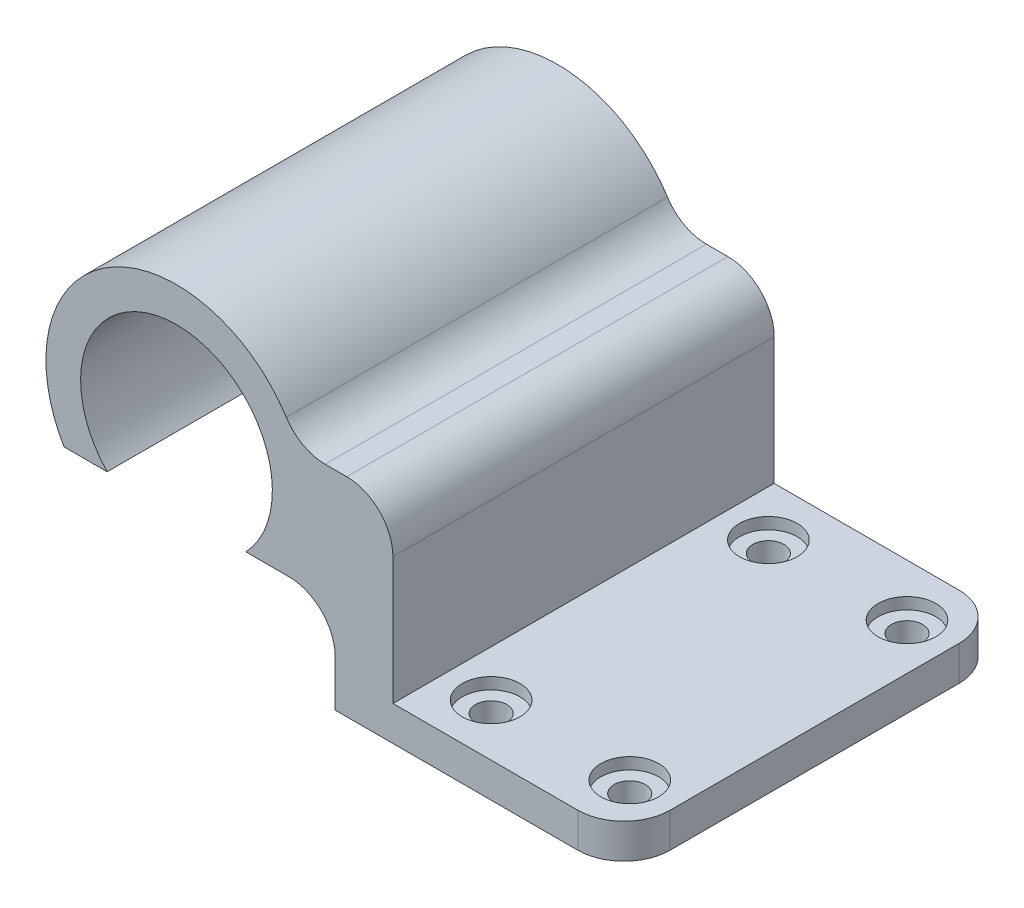
ISO-10303-21;
HEADER;
FILE_DESCRIPTION(('STEP AP214'),'2;1');
FILE_NAME('part.step','',(''),(''),'','','');
FILE_SCHEMA(('AUTOMOTIVE_DESIGN { 1 0 10303 214 1 1 1 1 }'));
ENDSEC;
DATA;
#1=APPLICATION_CONTEXT('core data for automotive mechanical design processes');
#2=APPLICATION_PROTOCOL_DEFINITION('international standard','automotive_design',2000,#1);
#3=PRODUCT_CONTEXT('',#1,'mechanical');
#4=PRODUCT('Part','Part','',(#3));
#5=PRODUCT_RELATED_PRODUCT_CATEGORY('part','',(#4));
#6=PRODUCT_DEFINITION_FORMATION('','',#4);
#7=PRODUCT_DEFINITION_CONTEXT('part definition',#1,'design');
#8=PRODUCT_DEFINITION('design','',#6,#7);
#9=PRODUCT_DEFINITION_SHAPE('','',#8);
#10=(LENGTH_UNIT() NAMED_UNIT(*) SI_UNIT(.MILLI.,.METRE.));
#11=(NAMED_UNIT(*) PLANE_ANGLE_UNIT() SI_UNIT($,.RADIAN.));
#12=(NAMED_UNIT(*) SI_UNIT($,.STERADIAN.) SOLID_ANGLE_UNIT());
#13=UNCERTAINTY_MEASURE_WITH_UNIT(LENGTH_MEASURE(1.E-05),#10,'distance_accuracy_value','');
#14=(GEOMETRIC_REPRESENTATION_CONTEXT(3) GLOBAL_UNCERTAINTY_ASSIGNED_CONTEXT((#13)) GLOBAL_UNIT_ASSIGNED_CONTEXT((#10,
#11,#12)) REPRESENTATION_CONTEXT('',''));
#15=CARTESIAN_POINT('',(0.,0.,0.));
#16=DIRECTION('',(0.,0.,1.));
#17=DIRECTION('',(1.,0.,0.));
#18=AXIS2_PLACEMENT_3D('',#15,#16,#17);
#19=CARTESIAN_POINT('',(22.7365291557105,-20.7349803835759,4.5));
#20=DIRECTION('',(0.,1.,0.));
#21=DIRECTION('',(-1.,0.,0.));
#22=AXIS2_PLACEMENT_3D('',#19,#20,#21);
#23=CYLINDRICAL_SURFACE('',#22,1.35);
#24=CARTESIAN_POINT('',(22.7365291557105,-13.7349803835759,4.5));
#25=DIRECTION('',(0.,-1.,0.));
#26=DIRECTION('',(1.,0.,0.));
#27=AXIS2_PLACEMENT_3D('',#24,#25,#26);
#28=CIRCLE('',#27,1.35);
#29=CARTESIAN_POINT('',(24.0865291557105,-13.7349803835759,4.5));
#30=VERTEX_POINT('',#29);
#31=EDGE_CURVE('E183',#30,#30,#28,.T.);
#32=ORIENTED_EDGE('',*,*,#31,.T.);
#33=EDGE_LOOP('',(#32));
#34=FACE_BOUND('',#33,.T.);
#35=CARTESIAN_POINT('',(22.7365291557105,-11.7349803835759,4.5));
#36=DIRECTION('',(0.,1.,0.));
#37=DIRECTION('',(-1.,0.,0.));
#38=AXIS2_PLACEMENT_3D('',#35,#36,#37);
#39=CIRCLE('',#38,1.35);
#40=CARTESIAN_POINT('',(21.3865291557105,-11.7349803835759,4.5));
#41=VERTEX_POINT('',#40);
#42=EDGE_CURVE('E272',#41,#41,#39,.F.);
#43=ORIENTED_EDGE('',*,*,#42,.F.);
#44=EDGE_LOOP('',(#43));
#45=FACE_BOUND('',#44,.T.);
#46=ADVANCED_FACE('F35',(#34,#45),#23,.F.);
#47=CARTESIAN_POINT('',(34.7365291557105,-20.7349803835759,28.5));
#48=DIRECTION('',(0.,1.,0.));
#49=DIRECTION('',(-1.,0.,0.));
#50=AXIS2_PLACEMENT_3D('',#47,#48,#49);
#51=CYLINDRICAL_SURFACE('',#50,1.35);
#52=CARTESIAN_POINT('',(34.7365291557105,-13.7349803835759,28.5));
#53=DIRECTION('',(0.,-1.,0.));
#54=DIRECTION('',(1.,0.,0.));
#55=AXIS2_PLACEMENT_3D('',#52,#53,#54);
#56=CIRCLE('',#55,1.35);
#57=CARTESIAN_POINT('',(36.0865291557105,-13.7349803835759,28.5));
#58=VERTEX_POINT('',#57);
#59=EDGE_CURVE('E256',#58,#58,#56,.T.);
#60=ORIENTED_EDGE('',*,*,#59,.T.);
#61=EDGE_LOOP('',(#60));
#62=FACE_BOUND('',#61,.T.);
#63=CARTESIAN_POINT('',(34.7365291557105,-11.7349803835759,28.5));
#64=DIRECTION('',(0.,1.,0.));
#65=DIRECTION('',(-1.,0.,0.));
#66=AXIS2_PLACEMENT_3D('',#63,#64,#65);
#67=CIRCLE('',#66,1.35);
#68=CARTESIAN_POINT('',(33.3865291557105,-11.7349803835759,28.5));
#69=VERTEX_POINT('',#68);
#70=EDGE_CURVE('E268',#69,#69,#67,.F.);
#71=ORIENTED_EDGE('',*,*,#70,.F.);
#72=EDGE_LOOP('',(#71));
#73=FACE_BOUND('',#72,.T.);
#74=ADVANCED_FACE('F348',(#62,#73),#51,.F.);
#75=CARTESIAN_POINT('',(34.7365291557105,-20.7349803835759,4.5));
#76=DIRECTION('',(0.,1.,0.));
#77=DIRECTION('',(-1.,0.,0.));
#78=AXIS2_PLACEMENT_3D('',#75,#76,#77);
#79=CYLINDRICAL_SURFACE('',#78,1.35);
#80=CARTESIAN_POINT('',(34.7365291557105,-13.7349803835759,4.5));
#81=DIRECTION('',(0.,-1.,0.));
#82=DIRECTION('',(1.,0.,0.));
#83=AXIS2_PLACEMENT_3D('',#80,#81,#82);
#84=CIRCLE('',#83,1.35);
#85=CARTESIAN_POINT('',(36.0865291557105,-13.7349803835759,4.5));
#86=VERTEX_POINT('',#85);
#87=EDGE_CURVE('E252',#86,#86,#84,.T.);
#88=ORIENTED_EDGE('',*,*,#87,.T.);
#89=EDGE_LOOP('',(#88));
#90=FACE_BOUND('',#89,.T.);
#91=CARTESIAN_POINT('',(34.7365291557105,-11.7349803835759,4.5));
#92=DIRECTION('',(0.,1.,0.));
#93=DIRECTION('',(-1.,0.,0.));
#94=AXIS2_PLACEMENT_3D('',#91,#92,#93);
#95=CIRCLE('',#94,1.35);
#96=CARTESIAN_POINT('',(33.3865291557105,-11.7349803835759,4.5));
#97=VERTEX_POINT('',#96);
#98=EDGE_CURVE('E265',#97,#97,#95,.F.);
#99=ORIENTED_EDGE('',*,*,#98,.F.);
#100=EDGE_LOOP('',(#99));
#101=FACE_BOUND('',#100,.T.);
#102=ADVANCED_FACE('F354',(#90,#101),#79,.F.);
#103=CARTESIAN_POINT('',(22.7365291557105,-20.7349803835759,28.5));
#104=DIRECTION('',(0.,1.,0.));
#105=DIRECTION('',(-1.,0.,0.));
#106=AXIS2_PLACEMENT_3D('',#103,#104,#105);
#107=CYLINDRICAL_SURFACE('',#106,1.35);
#108=CARTESIAN_POINT('',(22.7365291557105,-13.7349803835759,28.5));
#109=DIRECTION('',(0.,-1.,0.));
#110=DIRECTION('',(1.,0.,0.));
#111=AXIS2_PLACEMENT_3D('',#108,#109,#110);
#112=CIRCLE('',#111,1.35);
#113=CARTESIAN_POINT('',(24.0865291557105,-13.7349803835759,28.5));
#114=VERTEX_POINT('',#113);
#115=EDGE_CURVE('E253',#114,#114,#112,.T.);
#116=ORIENTED_EDGE('',*,*,#115,.T.);
#117=EDGE_LOOP('',(#116));
#118=FACE_BOUND('',#117,.T.);
#119=CARTESIAN_POINT('',(22.7365291557105,-11.7349803835759,28.5));
#120=DIRECTION('',(0.,1.,0.));
#121=DIRECTION('',(-1.,0.,0.));
#122=AXIS2_PLACEMENT_3D('',#119,#120,#121);
#123=CIRCLE('',#122,1.35);
#124=CARTESIAN_POINT('',(21.3865291557105,-11.7349803835759,28.5));
#125=VERTEX_POINT('',#124);
#126=EDGE_CURVE('E257',#125,#125,#123,.F.);
#127=ORIENTED_EDGE('',*,*,#126,.F.);
#128=EDGE_LOOP('',(#127));
#129=FACE_BOUND('',#128,.T.);
#130=ADVANCED_FACE('F360',(#118,#129),#107,.F.);
#131=CARTESIAN_POINT('',(0.,-5.73498038357587,33.));
#132=DIRECTION('',(0.,1.,0.));
#133=DIRECTION('',(0.,0.,1.));
#134=AXIS2_PLACEMENT_3D('',#131,#132,#133);
#135=PLANE('',#134);
#136=DIRECTION('',(1.,0.,0.));
#137=VECTOR('',#136,1.);
#138=CARTESIAN_POINT('',(0.,-5.73498038357587,0.));
#139=LINE('',#138,#137);
#140=CARTESIAN_POINT('',(6.,-5.73498038357587,0.));
#141=VERTEX_POINT('',#140);
#142=CARTESIAN_POINT('',(9.73652915571047,-5.73498038357587,0.));
#143=VERTEX_POINT('',#142);
#144=EDGE_CURVE('E186',#141,#143,#139,.T.);
#145=ORIENTED_EDGE('',*,*,#144,.T.);
#146=DIRECTION('',(0.,0.,-1.));
#147=VECTOR('',#146,1.);
#148=CARTESIAN_POINT('',(9.73652915571047,-5.73498038357587,33.));
#149=LINE('',#148,#147);
#150=CARTESIAN_POINT('',(9.73652915571047,-5.73498038357587,33.));
#151=VERTEX_POINT('',#150);
#152=EDGE_CURVE('E244',#143,#151,#149,.F.);
#153=ORIENTED_EDGE('',*,*,#152,.T.);
#154=DIRECTION('',(1.,0.,0.));
#155=VECTOR('',#154,1.);
#156=CARTESIAN_POINT('',(0.,-5.73498038357587,33.));
#157=LINE('',#156,#155);
#158=CARTESIAN_POINT('',(6.,-5.73498038357587,33.));
#159=VERTEX_POINT('',#158);
#160=EDGE_CURVE('E198',#159,#151,#157,.T.);
#161=ORIENTED_EDGE('',*,*,#160,.F.);
#162=DIRECTION('',(0.,0.,-1.));
#163=VECTOR('',#162,1.);
#164=CARTESIAN_POINT('',(6.,-5.73498038357587,33.));
#165=LINE('',#164,#163);
#166=EDGE_CURVE('E209',#159,#141,#165,.T.);
#167=ORIENTED_EDGE('',*,*,#166,.T.);
#168=EDGE_LOOP('',(#145,#153,#161,#167));
#169=FACE_BOUND('',#168,.T.);
#170=ADVANCED_FACE('F306',(#169),#135,.F.);
#171=CARTESIAN_POINT('',(0.,0.,33.));
#172=DIRECTION('',(0.,0.,-1.));
#173=DIRECTION('',(-1.,0.,0.));
#174=AXIS2_PLACEMENT_3D('',#171,#172,#173);
#175=CYLINDRICAL_SURFACE('',#174,11.3);
#176=CARTESIAN_POINT('',(0.,0.,33.));
#177=DIRECTION('',(0.,0.,1.));
#178=DIRECTION('',(1.,0.,0.));
#179=AXIS2_PLACEMENT_3D('',#176,#177,#178);
#180=CIRCLE('',#179,11.3);
#181=CARTESIAN_POINT('',(9.50938347003215,6.10423017422175,33.));
#182=VERTEX_POINT('',#181);
#183=CARTESIAN_POINT('',(-9.73652915571047,-5.73498038357586,33.));
#184=VERTEX_POINT('',#183);
#185=EDGE_CURVE('E201',#182,#184,#180,.T.);
#186=ORIENTED_EDGE('',*,*,#185,.F.);
#187=DIRECTION('',(0.,0.,-1.));
#188=VECTOR('',#187,1.);
#189=CARTESIAN_POINT('',(9.50938347003216,6.10423017422175,33.));
#190=LINE('',#189,#188);
#191=CARTESIAN_POINT('',(9.50938347003215,6.10423017422175,0.));
#192=VERTEX_POINT('',#191);
#193=EDGE_CURVE('E236',#182,#192,#190,.T.);
#194=ORIENTED_EDGE('',*,*,#193,.T.);
#195=CARTESIAN_POINT('',(0.,0.,0.));
#196=DIRECTION('',(0.,0.,1.));
#197=DIRECTION('',(1.,0.,0.));
#198=AXIS2_PLACEMENT_3D('',#195,#196,#197);
#199=CIRCLE('',#198,11.3);
#200=CARTESIAN_POINT('',(-9.73652915571047,-5.73498038357586,0.));
#201=VERTEX_POINT('',#200);
#202=EDGE_CURVE('E212',#192,#201,#199,.T.);
#203=ORIENTED_EDGE('',*,*,#202,.T.);
#204=DIRECTION('',(0.,0.,-1.));
#205=VECTOR('',#204,1.);
#206=CARTESIAN_POINT('',(-9.73652915571047,-5.73498038357586,33.));
#207=LINE('',#206,#205);
#208=EDGE_CURVE('E222',#184,#201,#207,.T.);
#209=ORIENTED_EDGE('',*,*,#208,.F.);
#210=EDGE_LOOP('',(#186,#194,#203,#209));
#211=FACE_BOUND('',#210,.T.);
#212=ADVANCED_FACE('F320',(#211),#175,.T.);
#213=CARTESIAN_POINT('',(0.,-5.73498038357586,33.));
#214=DIRECTION('',(0.,1.,0.));
#215=DIRECTION('',(0.,0.,1.));
#216=AXIS2_PLACEMENT_3D('',#213,#214,#215);
#217=PLANE('',#216);
#218=DIRECTION('',(1.,0.,0.));
#219=VECTOR('',#218,1.);
#220=CARTESIAN_POINT('',(0.,-5.73498038357586,0.));
#221=LINE('',#220,#219);
#222=CARTESIAN_POINT('',(-6.,-5.73498038357586,0.));
#223=VERTEX_POINT('',#222);
#224=EDGE_CURVE('E214',#201,#223,#221,.T.);
#225=ORIENTED_EDGE('',*,*,#224,.T.);
#226=DIRECTION('',(0.,0.,-1.));
#227=VECTOR('',#226,1.);
#228=CARTESIAN_POINT('',(-6.,-5.73498038357586,33.));
#229=LINE('',#228,#227);
#230=CARTESIAN_POINT('',(-6.,-5.73498038357586,33.));
#231=VERTEX_POINT('',#230);
#232=EDGE_CURVE('E220',#231,#223,#229,.T.);
#233=ORIENTED_EDGE('',*,*,#232,.F.);
#234=DIRECTION('',(1.,0.,0.));
#235=VECTOR('',#234,1.);
#236=CARTESIAN_POINT('',(0.,-5.73498038357586,33.));
#237=LINE('',#236,#235);
#238=EDGE_CURVE('E204',#184,#231,#237,.T.);
#239=ORIENTED_EDGE('',*,*,#238,.F.);
#240=ORIENTED_EDGE('',*,*,#208,.T.);
#241=EDGE_LOOP('',(#225,#233,#239,#240));
#242=FACE_BOUND('',#241,.T.);
#243=ADVANCED_FACE('F315',(#242),#217,.F.);
#244=CARTESIAN_POINT('',(0.,0.,33.));
#245=DIRECTION('',(0.,0.,-1.));
#246=DIRECTION('',(-1.,0.,0.));
#247=AXIS2_PLACEMENT_3D('',#244,#245,#246);
#248=CYLINDRICAL_SURFACE('',#247,8.3);
#249=CARTESIAN_POINT('',(0.,0.,0.));
#250=DIRECTION('',(0.,0.,1.));
#251=DIRECTION('',(1.,0.,0.));
#252=AXIS2_PLACEMENT_3D('',#249,#250,#251);
#253=CIRCLE('',#252,8.3);
#254=EDGE_CURVE('E202',#141,#223,#253,.T.);
#255=ORIENTED_EDGE('',*,*,#254,.F.);
#256=ORIENTED_EDGE('',*,*,#166,.F.);
#257=CARTESIAN_POINT('',(0.,0.,33.));
#258=DIRECTION('',(0.,0.,1.));
#259=DIRECTION('',(1.,0.,0.));
#260=AXIS2_PLACEMENT_3D('',#257,#258,#259);
#261=CIRCLE('',#260,8.3);
#262=EDGE_CURVE('E206',#159,#231,#261,.T.);
#263=ORIENTED_EDGE('',*,*,#262,.T.);
#264=ORIENTED_EDGE('',*,*,#232,.T.);
#265=EDGE_LOOP('',(#255,#256,#263,#264));
#266=FACE_BOUND('',#265,.T.);
#267=ADVANCED_FACE('F310',(#266),#248,.F.);
#268=CARTESIAN_POINT('',(0.,0.,33.));
#269=DIRECTION('',(0.,0.,1.));
#270=DIRECTION('',(1.,0.,0.));
#271=AXIS2_PLACEMENT_3D('',#268,#269,#270);
#272=PLANE('',#271);
#273=DIRECTION('',(-1.,0.,0.));
#274=VECTOR('',#273,1.);
#275=CARTESIAN_POINT('',(38.7365291557105,-13.7349803835759,33.));
#276=LINE('',#275,#274);
#277=CARTESIAN_POINT('',(34.7365291557105,-13.7349803835759,33.));
#278=VERTEX_POINT('',#277);
#279=CARTESIAN_POINT('',(13.7365291557105,-13.7349803835759,33.));
#280=VERTEX_POINT('',#279);
#281=EDGE_CURVE('E159',#278,#280,#276,.T.);
#282=ORIENTED_EDGE('',*,*,#281,.F.);
#283=DIRECTION('',(0.,-1.,0.));
#284=VECTOR('',#283,1.);
#285=CARTESIAN_POINT('',(34.7365291557105,0.,33.));
#286=LINE('',#285,#284);
#287=CARTESIAN_POINT('',(34.7365291557105,-10.7349803835759,33.));
#288=VERTEX_POINT('',#287);
#289=EDGE_CURVE('E11',#278,#288,#286,.F.);
#290=ORIENTED_EDGE('',*,*,#289,.T.);
#291=DIRECTION('',(1.,0.,0.));
#292=VECTOR('',#291,1.);
#293=CARTESIAN_POINT('',(18.7365291557105,-10.7349803835759,33.));
#294=LINE('',#293,#292);
#295=CARTESIAN_POINT('',(18.7365291557105,-10.7349803835759,33.));
#296=VERTEX_POINT('',#295);
#297=EDGE_CURVE('E189',#296,#288,#294,.T.);
#298=ORIENTED_EDGE('',*,*,#297,.F.);
#299=DIRECTION('',(0.,-1.,0.));
#300=VECTOR('',#299,1.);
#301=CARTESIAN_POINT('',(18.7365291557105,4.26501961642413,33.));
#302=LINE('',#301,#300);
#303=CARTESIAN_POINT('',(18.7365291557105,0.265019616424135,33.));
#304=VERTEX_POINT('',#303);
#305=EDGE_CURVE('E172',#304,#296,#302,.T.);
#306=ORIENTED_EDGE('',*,*,#305,.F.);
#307=CARTESIAN_POINT('',(14.7365291557105,0.265019616424135,33.));
#308=DIRECTION('',(0.,0.,1.));
#309=DIRECTION('',(1.,0.,0.));
#310=AXIS2_PLACEMENT_3D('',#307,#308,#309);
#311=CIRCLE('',#310,4.);
#312=CARTESIAN_POINT('',(14.7365291557105,4.26501961642413,33.));
#313=VERTEX_POINT('',#312);
#314=EDGE_CURVE('E234',#304,#313,#311,.T.);
#315=ORIENTED_EDGE('',*,*,#314,.T.);
#316=DIRECTION('',(1.,0.,0.));
#317=VECTOR('',#316,1.);
#318=CARTESIAN_POINT('',(10.4642060220314,4.26501961642414,33.));
#319=LINE('',#318,#317);
#320=CARTESIAN_POINT('',(12.8755369107515,4.26501961642413,33.));
#321=VERTEX_POINT('',#320);
#322=EDGE_CURVE('E169',#321,#313,#319,.T.);
#323=ORIENTED_EDGE('',*,*,#322,.F.);
#324=CARTESIAN_POINT('',(12.8755369107515,8.26501961642413,33.));
#325=DIRECTION('',(0.,0.,1.));
#326=DIRECTION('',(1.,0.,0.));
#327=AXIS2_PLACEMENT_3D('',#324,#325,#326);
#328=CIRCLE('',#327,4.);
#329=EDGE_CURVE('E241',#321,#182,#328,.F.);
#330=ORIENTED_EDGE('',*,*,#329,.T.);
#331=ORIENTED_EDGE('',*,*,#185,.T.);
#332=ORIENTED_EDGE('',*,*,#238,.T.);
#333=ORIENTED_EDGE('',*,*,#262,.F.);
#334=ORIENTED_EDGE('',*,*,#160,.T.);
#335=CARTESIAN_POINT('',(9.73652915571047,-9.73498038357587,33.));
#336=DIRECTION('',(0.,0.,1.));
#337=DIRECTION('',(1.,0.,0.));
#338=AXIS2_PLACEMENT_3D('',#335,#336,#337);
#339=CIRCLE('',#338,4.);
#340=CARTESIAN_POINT('',(13.7365291557105,-9.73498038357587,33.));
#341=VERTEX_POINT('',#340);
#342=EDGE_CURVE('E248',#151,#341,#339,.F.);
#343=ORIENTED_EDGE('',*,*,#342,.T.);
#344=DIRECTION('',(0.,1.,0.));
#345=VECTOR('',#344,1.);
#346=CARTESIAN_POINT('',(13.7365291557105,-13.7349803835759,33.));
#347=LINE('',#346,#345);
#348=EDGE_CURVE('E163',#280,#341,#347,.T.);
#349=ORIENTED_EDGE('',*,*,#348,.F.);
#350=EDGE_LOOP('',(#282,#290,#298,#306,#315,#323,#330,#331,#332,#333,#334,#343,#349));
#351=FACE_BOUND('',#350,.T.);
#352=ADVANCED_FACE('F298',(#351),#272,.T.);
#353=CARTESIAN_POINT('',(0.,0.,0.));
#354=DIRECTION('',(0.,0.,1.));
#355=DIRECTION('',(1.,0.,0.));
#356=AXIS2_PLACEMENT_3D('',#353,#354,#355);
#357=PLANE('',#356);
#358=DIRECTION('',(1.,0.,0.));
#359=VECTOR('',#358,1.);
#360=CARTESIAN_POINT('',(18.7365291557105,-10.7349803835759,0.));
#361=LINE('',#360,#359);
#362=CARTESIAN_POINT('',(18.7365291557105,-10.7349803835759,0.));
#363=VERTEX_POINT('',#362);
#364=CARTESIAN_POINT('',(34.7365291557105,-10.7349803835759,0.));
#365=VERTEX_POINT('',#364);
#366=EDGE_CURVE('E154',#363,#365,#361,.T.);
#367=ORIENTED_EDGE('',*,*,#366,.T.);
#368=DIRECTION('',(0.,-1.,0.));
#369=VECTOR('',#368,1.);
#370=CARTESIAN_POINT('',(34.7365291557105,-13.7349803835759,0.));
#371=LINE('',#370,#369);
#372=CARTESIAN_POINT('',(34.7365291557105,-13.7349803835759,0.));
#373=VERTEX_POINT('',#372);
#374=EDGE_CURVE('E152',#365,#373,#371,.T.);
#375=ORIENTED_EDGE('',*,*,#374,.T.);
#376=DIRECTION('',(-1.,0.,0.));
#377=VECTOR('',#376,1.);
#378=CARTESIAN_POINT('',(38.7365291557105,-13.7349803835759,0.));
#379=LINE('',#378,#377);
#380=CARTESIAN_POINT('',(13.7365291557105,-13.7349803835759,0.));
#381=VERTEX_POINT('',#380);
#382=EDGE_CURVE('E145',#373,#381,#379,.T.);
#383=ORIENTED_EDGE('',*,*,#382,.T.);
#384=DIRECTION('',(0.,1.,0.));
#385=VECTOR('',#384,1.);
#386=CARTESIAN_POINT('',(13.7365291557105,-13.7349803835759,0.));
#387=LINE('',#386,#385);
#388=CARTESIAN_POINT('',(13.7365291557105,-9.73498038357587,0.));
#389=VERTEX_POINT('',#388);
#390=EDGE_CURVE('E150',#381,#389,#387,.T.);
#391=ORIENTED_EDGE('',*,*,#390,.T.);
#392=CARTESIAN_POINT('',(9.73652915571047,-9.73498038357587,0.));
#393=DIRECTION('',(0.,0.,1.));
#394=DIRECTION('',(1.,0.,0.));
#395=AXIS2_PLACEMENT_3D('',#392,#393,#394);
#396=CIRCLE('',#395,4.);
#397=EDGE_CURVE('E246',#389,#143,#396,.T.);
#398=ORIENTED_EDGE('',*,*,#397,.T.);
#399=ORIENTED_EDGE('',*,*,#144,.F.);
#400=ORIENTED_EDGE('',*,*,#254,.T.);
#401=ORIENTED_EDGE('',*,*,#224,.F.);
#402=ORIENTED_EDGE('',*,*,#202,.F.);
#403=CARTESIAN_POINT('',(12.8755369107515,8.26501961642413,0.));
#404=DIRECTION('',(0.,0.,1.));
#405=DIRECTION('',(1.,0.,0.));
#406=AXIS2_PLACEMENT_3D('',#403,#404,#405);
#407=CIRCLE('',#406,4.);
#408=CARTESIAN_POINT('',(12.8755369107515,4.26501961642413,0.));
#409=VERTEX_POINT('',#408);
#410=EDGE_CURVE('E239',#192,#409,#407,.T.);
#411=ORIENTED_EDGE('',*,*,#410,.T.);
#412=DIRECTION('',(1.,0.,0.));
#413=VECTOR('',#412,1.);
#414=CARTESIAN_POINT('',(10.4642060220314,4.26501961642414,0.));
#415=LINE('',#414,#413);
#416=CARTESIAN_POINT('',(14.7365291557105,4.26501961642413,0.));
#417=VERTEX_POINT('',#416);
#418=EDGE_CURVE('E181',#409,#417,#415,.T.);
#419=ORIENTED_EDGE('',*,*,#418,.T.);
#420=CARTESIAN_POINT('',(14.7365291557105,0.265019616424135,0.));
#421=DIRECTION('',(0.,0.,1.));
#422=DIRECTION('',(1.,0.,0.));
#423=AXIS2_PLACEMENT_3D('',#420,#421,#422);
#424=CIRCLE('',#423,4.);
#425=CARTESIAN_POINT('',(18.7365291557105,0.265019616424137,0.));
#426=VERTEX_POINT('',#425);
#427=EDGE_CURVE('E230',#417,#426,#424,.F.);
#428=ORIENTED_EDGE('',*,*,#427,.T.);
#429=DIRECTION('',(0.,-1.,0.));
#430=VECTOR('',#429,1.);
#431=CARTESIAN_POINT('',(18.7365291557105,4.26501961642413,0.));
#432=LINE('',#431,#430);
#433=EDGE_CURVE('E179',#426,#363,#432,.T.);
#434=ORIENTED_EDGE('',*,*,#433,.T.);
#435=EDGE_LOOP('',(#367,#375,#383,#391,#398,#399,#400,#401,#402,#411,#419,#428,#434));
#436=FACE_BOUND('',#435,.T.);
#437=ADVANCED_FACE('F148',(#436),#357,.F.);
#438=CARTESIAN_POINT('',(10.4642060220314,4.26501961642414,67.132096331752));
#439=DIRECTION('',(0.,1.,0.));
#440=DIRECTION('',(-1.,0.,0.));
#441=AXIS2_PLACEMENT_3D('',#438,#439,#440);
#442=PLANE('',#441);
#443=ORIENTED_EDGE('',*,*,#322,.T.);
#444=DIRECTION('',(0.,0.,-1.));
#445=VECTOR('',#444,1.);
#446=CARTESIAN_POINT('',(14.7365291557105,4.26501961642413,67.132096331752));
#447=LINE('',#446,#445);
#448=EDGE_CURVE('E227',#313,#417,#447,.T.);
#449=ORIENTED_EDGE('',*,*,#448,.T.);
#450=ORIENTED_EDGE('',*,*,#418,.F.);
#451=DIRECTION('',(0.,0.,-1.));
#452=VECTOR('',#451,1.);
#453=CARTESIAN_POINT('',(12.8755369107515,4.26501961642413,67.132096331752));
#454=LINE('',#453,#452);
#455=EDGE_CURVE('E225',#409,#321,#454,.F.);
#456=ORIENTED_EDGE('',*,*,#455,.T.);
#457=EDGE_LOOP('',(#443,#449,#450,#456));
#458=FACE_BOUND('',#457,.T.);
#459=ADVANCED_FACE('F328',(#458),#442,.T.);
#460=CARTESIAN_POINT('',(18.7365291557105,4.26501961642413,67.132096331752));
#461=DIRECTION('',(1.,0.,0.));
#462=DIRECTION('',(0.,0.,-1.));
#463=AXIS2_PLACEMENT_3D('',#460,#461,#462);
#464=PLANE('',#463);
#465=ORIENTED_EDGE('',*,*,#433,.F.);
#466=DIRECTION('',(0.,0.,-1.));
#467=VECTOR('',#466,1.);
#468=CARTESIAN_POINT('',(18.7365291557105,0.265019616424135,67.132096331752));
#469=LINE('',#468,#467);
#470=EDGE_CURVE('E232',#426,#304,#469,.F.);
#471=ORIENTED_EDGE('',*,*,#470,.T.);
#472=ORIENTED_EDGE('',*,*,#305,.T.);
#473=DIRECTION('',(0.,0.,-1.));
#474=VECTOR('',#473,1.);
#475=CARTESIAN_POINT('',(18.7365291557105,-10.7349803835759,67.132096331752));
#476=LINE('',#475,#474);
#477=EDGE_CURVE('E192',#296,#363,#476,.T.);
#478=ORIENTED_EDGE('',*,*,#477,.T.);
#479=EDGE_LOOP('',(#465,#471,#472,#478));
#480=FACE_BOUND('',#479,.T.);
#481=ADVANCED_FACE('F336',(#480),#464,.T.);
#482=CARTESIAN_POINT('',(18.7365291557105,-10.7349803835759,67.132096331752));
#483=DIRECTION('',(0.,1.,0.));
#484=DIRECTION('',(-1.,0.,0.));
#485=AXIS2_PLACEMENT_3D('',#482,#483,#484);
#486=PLANE('',#485);
#487=CARTESIAN_POINT('',(34.7365291557105,-10.7349803835759,28.5));
#488=DIRECTION('',(0.,1.,0.));
#489=DIRECTION('',(-1.,0.,0.));
#490=AXIS2_PLACEMENT_3D('',#487,#488,#489);
#491=CIRCLE('',#490,2.49999999999999);
#492=CARTESIAN_POINT('',(32.2365291557105,-10.7349803835759,28.5));
#493=VERTEX_POINT('',#492);
#494=EDGE_CURVE('E642',#493,#493,#491,.T.);
#495=ORIENTED_EDGE('',*,*,#494,.F.);
#496=EDGE_LOOP('',(#495));
#497=FACE_BOUND('',#496,.T.);
#498=CARTESIAN_POINT('',(34.7365291557104,-10.7349803835759,4.5));
#499=DIRECTION('',(0.,1.,0.));
#500=DIRECTION('',(-1.,0.,0.));
#501=AXIS2_PLACEMENT_3D('',#498,#499,#500);
#502=CIRCLE('',#501,2.49999999999999);
#503=CARTESIAN_POINT('',(32.2365291557104,-10.7349803835759,4.5));
#504=VERTEX_POINT('',#503);
#505=EDGE_CURVE('E628',#504,#504,#502,.T.);
#506=ORIENTED_EDGE('',*,*,#505,.F.);
#507=EDGE_LOOP('',(#506));
#508=FACE_BOUND('',#507,.T.);
#509=CARTESIAN_POINT('',(22.7365291557104,-10.7349803835759,4.5));
#510=DIRECTION('',(0.,1.,0.));
#511=DIRECTION('',(-1.,0.,0.));
#512=AXIS2_PLACEMENT_3D('',#509,#510,#511);
#513=CIRCLE('',#512,2.5);
#514=CARTESIAN_POINT('',(20.2365291557104,-10.7349803835759,4.5));
#515=VERTEX_POINT('',#514);
#516=EDGE_CURVE('E625',#515,#515,#513,.T.);
#517=ORIENTED_EDGE('',*,*,#516,.F.);
#518=EDGE_LOOP('',(#517));
#519=FACE_BOUND('',#518,.T.);
#520=CARTESIAN_POINT('',(22.7365291557105,-10.7349803835759,28.5));
#521=DIRECTION('',(0.,1.,0.));
#522=DIRECTION('',(-1.,0.,0.));
#523=AXIS2_PLACEMENT_3D('',#520,#521,#522);
#524=CIRCLE('',#523,2.5);
#525=CARTESIAN_POINT('',(20.2365291557105,-10.7349803835759,28.5));
#526=VERTEX_POINT('',#525);
#527=EDGE_CURVE('E175',#526,#526,#524,.T.);
#528=ORIENTED_EDGE('',*,*,#527,.F.);
#529=EDGE_LOOP('',(#528));
#530=FACE_BOUND('',#529,.T.);
#531=DIRECTION('',(0.,0.,-1.));
#532=VECTOR('',#531,1.);
#533=CARTESIAN_POINT('',(38.7365291557105,-10.7349803835759,67.132096331752));
#534=LINE('',#533,#532);
#535=CARTESIAN_POINT('',(38.7365291557105,-10.7349803835759,29.));
#536=VERTEX_POINT('',#535);
#537=CARTESIAN_POINT('',(38.7365291557105,-10.7349803835759,4.));
#538=VERTEX_POINT('',#537);
#539=EDGE_CURVE('E191',#536,#538,#534,.T.);
#540=ORIENTED_EDGE('',*,*,#539,.T.);
#541=CARTESIAN_POINT('',(34.7365291557105,-10.7349803835759,4.));
#542=DIRECTION('',(0.,1.,0.));
#543=DIRECTION('',(-1.,0.,0.));
#544=AXIS2_PLACEMENT_3D('',#541,#542,#543);
#545=CIRCLE('',#544,4.);
#546=EDGE_CURVE('E43',#538,#365,#545,.T.);
#547=ORIENTED_EDGE('',*,*,#546,.T.);
#548=ORIENTED_EDGE('',*,*,#366,.F.);
#549=ORIENTED_EDGE('',*,*,#477,.F.);
#550=ORIENTED_EDGE('',*,*,#297,.T.);
#551=CARTESIAN_POINT('',(34.7365291557105,-10.7349803835759,29.));
#552=DIRECTION('',(0.,1.,0.));
#553=DIRECTION('',(-1.,0.,0.));
#554=AXIS2_PLACEMENT_3D('',#551,#552,#553);
#555=CIRCLE('',#554,4.);
#556=EDGE_CURVE('E284',#288,#536,#555,.T.);
#557=ORIENTED_EDGE('',*,*,#556,.T.);
#558=EDGE_LOOP('',(#540,#547,#548,#549,#550,#557));
#559=FACE_BOUND('',#558,.T.);
#560=ADVANCED_FACE('F288',(#497,#508,#519,#530,#559),#486,.T.);
#561=CARTESIAN_POINT('',(38.7365291557105,-10.7349803835759,67.132096331752));
#562=DIRECTION('',(1.,0.,0.));
#563=DIRECTION('',(0.,0.,-1.));
#564=AXIS2_PLACEMENT_3D('',#561,#562,#563);
#565=PLANE('',#564);
#566=DIRECTION('',(0.,0.,-1.));
#567=VECTOR('',#566,1.);
#568=CARTESIAN_POINT('',(38.7365291557105,-13.7349803835759,67.132096331752));
#569=LINE('',#568,#567);
#570=CARTESIAN_POINT('',(38.7365291557105,-13.7349803835759,29.));
#571=VERTEX_POINT('',#570);
#572=CARTESIAN_POINT('',(38.7365291557105,-13.7349803835759,4.));
#573=VERTEX_POINT('',#572);
#574=EDGE_CURVE('E188',#571,#573,#569,.T.);
#575=ORIENTED_EDGE('',*,*,#574,.T.);
#576=DIRECTION('',(0.,-1.,0.));
#577=VECTOR('',#576,1.);
#578=CARTESIAN_POINT('',(38.7365291557105,-10.7349803835759,4.));
#579=LINE('',#578,#577);
#580=EDGE_CURVE('E56',#573,#538,#579,.F.);
#581=ORIENTED_EDGE('',*,*,#580,.T.);
#582=ORIENTED_EDGE('',*,*,#539,.F.);
#583=DIRECTION('',(0.,-1.,0.));
#584=VECTOR('',#583,1.);
#585=CARTESIAN_POINT('',(38.7365291557105,-10.7349803835759,29.));
#586=LINE('',#585,#584);
#587=EDGE_CURVE('E280',#536,#571,#586,.T.);
#588=ORIENTED_EDGE('',*,*,#587,.T.);
#589=EDGE_LOOP('',(#575,#581,#582,#588));
#590=FACE_BOUND('',#589,.T.);
#591=ADVANCED_FACE('F294',(#590),#565,.T.);
#592=CARTESIAN_POINT('',(38.7365291557105,-13.7349803835759,67.132096331752));
#593=DIRECTION('',(0.,-1.,0.));
#594=DIRECTION('',(1.,0.,0.));
#595=AXIS2_PLACEMENT_3D('',#592,#593,#594);
#596=PLANE('',#595);
#597=ORIENTED_EDGE('',*,*,#87,.F.);
#598=EDGE_LOOP('',(#597));
#599=FACE_BOUND('',#598,.T.);
#600=ORIENTED_EDGE('',*,*,#59,.F.);
#601=EDGE_LOOP('',(#600));
#602=FACE_BOUND('',#601,.T.);
#603=ORIENTED_EDGE('',*,*,#115,.F.);
#604=EDGE_LOOP('',(#603));
#605=FACE_BOUND('',#604,.T.);
#606=ORIENTED_EDGE('',*,*,#31,.F.);
#607=EDGE_LOOP('',(#606));
#608=FACE_BOUND('',#607,.T.);
#609=ORIENTED_EDGE('',*,*,#382,.F.);
#610=CARTESIAN_POINT('',(34.7365291557105,-13.7349803835759,4.));
#611=DIRECTION('',(0.,-1.,0.));
#612=DIRECTION('',(1.,0.,0.));
#613=AXIS2_PLACEMENT_3D('',#610,#611,#612);
#614=CIRCLE('',#613,4.);
#615=EDGE_CURVE('E278',#373,#573,#614,.T.);
#616=ORIENTED_EDGE('',*,*,#615,.T.);
#617=ORIENTED_EDGE('',*,*,#574,.F.);
#618=CARTESIAN_POINT('',(34.7365291557105,-13.7349803835759,29.));
#619=DIRECTION('',(0.,-1.,0.));
#620=DIRECTION('',(1.,0.,0.));
#621=AXIS2_PLACEMENT_3D('',#618,#619,#620);
#622=CIRCLE('',#621,4.);
#623=EDGE_CURVE('E276',#571,#278,#622,.T.);
#624=ORIENTED_EDGE('',*,*,#623,.T.);
#625=ORIENTED_EDGE('',*,*,#281,.T.);
#626=DIRECTION('',(0.,0.,-1.));
#627=VECTOR('',#626,1.);
#628=CARTESIAN_POINT('',(13.7365291557105,-13.7349803835759,67.132096331752));
#629=LINE('',#628,#627);
#630=EDGE_CURVE('E157',#280,#381,#629,.T.);
#631=ORIENTED_EDGE('',*,*,#630,.T.);
#632=EDGE_LOOP('',(#609,#616,#617,#624,#625,#631));
#633=FACE_BOUND('',#632,.T.);
#634=ADVANCED_FACE('F158',(#599,#602,#605,#608,#633),#596,.T.);
#635=CARTESIAN_POINT('',(13.7365291557105,-13.7349803835759,67.132096331752));
#636=DIRECTION('',(-1.,0.,0.));
#637=DIRECTION('',(0.,0.,1.));
#638=AXIS2_PLACEMENT_3D('',#635,#636,#637);
#639=PLANE('',#638);
#640=ORIENTED_EDGE('',*,*,#348,.T.);
#641=DIRECTION('',(0.,0.,-1.));
#642=VECTOR('',#641,1.);
#643=CARTESIAN_POINT('',(13.7365291557105,-9.73498038357587,67.132096331752));
#644=LINE('',#643,#642);
#645=EDGE_CURVE('E168',#341,#389,#644,.T.);
#646=ORIENTED_EDGE('',*,*,#645,.T.);
#647=ORIENTED_EDGE('',*,*,#390,.F.);
#648=ORIENTED_EDGE('',*,*,#630,.F.);
#649=EDGE_LOOP('',(#640,#646,#647,#648));
#650=FACE_BOUND('',#649,.T.);
#651=ADVANCED_FACE('F166',(#650),#639,.T.);
#652=CARTESIAN_POINT('',(14.7365291557105,0.265019616424135,67.132096331752));
#653=DIRECTION('',(0.,0.,-1.));
#654=DIRECTION('',(-1.,0.,0.));
#655=AXIS2_PLACEMENT_3D('',#652,#653,#654);
#656=CYLINDRICAL_SURFACE('',#655,4.);
#657=ORIENTED_EDGE('',*,*,#314,.F.);
#658=ORIENTED_EDGE('',*,*,#470,.F.);
#659=ORIENTED_EDGE('',*,*,#427,.F.);
#660=ORIENTED_EDGE('',*,*,#448,.F.);
#661=EDGE_LOOP('',(#657,#658,#659,#660));
#662=FACE_BOUND('',#661,.T.);
#663=ADVANCED_FACE('F333',(#662),#656,.T.);
#664=CARTESIAN_POINT('',(12.8755369107515,8.26501961642413,33.));
#665=DIRECTION('',(0.,0.,-1.));
#666=DIRECTION('',(-1.,0.,0.));
#667=AXIS2_PLACEMENT_3D('',#664,#665,#666);
#668=CYLINDRICAL_SURFACE('',#667,4.);
#669=ORIENTED_EDGE('',*,*,#329,.F.);
#670=ORIENTED_EDGE('',*,*,#455,.F.);
#671=ORIENTED_EDGE('',*,*,#410,.F.);
#672=ORIENTED_EDGE('',*,*,#193,.F.);
#673=EDGE_LOOP('',(#669,#670,#671,#672));
#674=FACE_BOUND('',#673,.T.);
#675=ADVANCED_FACE('F324',(#674),#668,.F.);
#676=CARTESIAN_POINT('',(9.73652915571047,-9.73498038357587,67.132096331752));
#677=DIRECTION('',(0.,0.,-1.));
#678=DIRECTION('',(-1.,0.,0.));
#679=AXIS2_PLACEMENT_3D('',#676,#677,#678);
#680=CYLINDRICAL_SURFACE('',#679,4.);
#681=ORIENTED_EDGE('',*,*,#342,.F.);
#682=ORIENTED_EDGE('',*,*,#152,.F.);
#683=ORIENTED_EDGE('',*,*,#397,.F.);
#684=ORIENTED_EDGE('',*,*,#645,.F.);
#685=EDGE_LOOP('',(#681,#682,#683,#684));
#686=FACE_BOUND('',#685,.T.);
#687=ADVANCED_FACE('F301',(#686),#680,.F.);
#688=CARTESIAN_POINT('',(22.7365291557105,-11.7349803835759,28.5));
#689=DIRECTION('',(0.,1.,0.));
#690=DIRECTION('',(-1.,0.,0.));
#691=AXIS2_PLACEMENT_3D('',#688,#689,#690);
#692=PLANE('',#691);
#693=CARTESIAN_POINT('',(22.7365291557105,-11.7349803835759,28.5));
#694=DIRECTION('',(0.,1.,0.));
#695=DIRECTION('',(-1.,0.,0.));
#696=AXIS2_PLACEMENT_3D('',#693,#694,#695);
#697=CIRCLE('',#696,2.5);
#698=CARTESIAN_POINT('',(20.2365291557105,-11.7349803835759,28.5));
#699=VERTEX_POINT('',#698);
#700=EDGE_CURVE('E264',#699,#699,#697,.T.);
#701=ORIENTED_EDGE('',*,*,#700,.T.);
#702=EDGE_LOOP('',(#701));
#703=FACE_BOUND('',#702,.T.);
#704=ORIENTED_EDGE('',*,*,#126,.T.);
#705=EDGE_LOOP('',(#704));
#706=FACE_BOUND('',#705,.T.);
#707=ADVANCED_FACE('F399',(#703,#706),#692,.T.);
#708=CARTESIAN_POINT('',(22.7365291557105,-11.7349803835759,28.5));
#709=DIRECTION('',(0.,1.,0.));
#710=DIRECTION('',(-1.,0.,0.));
#711=AXIS2_PLACEMENT_3D('',#708,#709,#710);
#712=CYLINDRICAL_SURFACE('',#711,2.5);
#713=ORIENTED_EDGE('',*,*,#700,.F.);
#714=EDGE_LOOP('',(#713));
#715=FACE_BOUND('',#714,.T.);
#716=ORIENTED_EDGE('',*,*,#527,.T.);
#717=EDGE_LOOP('',(#716));
#718=FACE_BOUND('',#717,.T.);
#719=ADVANCED_FACE('F406',(#715,#718),#712,.F.);
#720=CARTESIAN_POINT('',(34.7365291557104,-11.7349803835759,4.5));
#721=DIRECTION('',(0.,1.,0.));
#722=DIRECTION('',(-1.,0.,0.));
#723=AXIS2_PLACEMENT_3D('',#720,#721,#722);
#724=PLANE('',#723);
#725=CARTESIAN_POINT('',(34.7365291557104,-11.7349803835759,4.5));
#726=DIRECTION('',(0.,1.,0.));
#727=DIRECTION('',(-1.,0.,0.));
#728=AXIS2_PLACEMENT_3D('',#725,#726,#727);
#729=CIRCLE('',#728,2.49999999999999);
#730=CARTESIAN_POINT('',(32.2365291557104,-11.7349803835759,4.5));
#731=VERTEX_POINT('',#730);
#732=EDGE_CURVE('E639',#731,#731,#729,.T.);
#733=ORIENTED_EDGE('',*,*,#732,.T.);
#734=EDGE_LOOP('',(#733));
#735=FACE_BOUND('',#734,.T.);
#736=ORIENTED_EDGE('',*,*,#98,.T.);
#737=EDGE_LOOP('',(#736));
#738=FACE_BOUND('',#737,.T.);
#739=ADVANCED_FACE('F415',(#735,#738),#724,.T.);
#740=CARTESIAN_POINT('',(34.7365291557104,-11.7349803835759,4.5));
#741=DIRECTION('',(0.,1.,0.));
#742=DIRECTION('',(-1.,0.,0.));
#743=AXIS2_PLACEMENT_3D('',#740,#741,#742);
#744=CYLINDRICAL_SURFACE('',#743,2.49999999999999);
#745=ORIENTED_EDGE('',*,*,#732,.F.);
#746=EDGE_LOOP('',(#745));
#747=FACE_BOUND('',#746,.T.);
#748=ORIENTED_EDGE('',*,*,#505,.T.);
#749=EDGE_LOOP('',(#748));
#750=FACE_BOUND('',#749,.T.);
#751=ADVANCED_FACE('F423',(#747,#750),#744,.F.);
#752=CARTESIAN_POINT('',(34.7365291557105,-11.7349803835759,28.5));
#753=DIRECTION('',(0.,1.,0.));
#754=DIRECTION('',(-1.,0.,0.));
#755=AXIS2_PLACEMENT_3D('',#752,#753,#754);
#756=PLANE('',#755);
#757=CARTESIAN_POINT('',(34.7365291557105,-11.7349803835759,28.5));
#758=DIRECTION('',(0.,1.,0.));
#759=DIRECTION('',(-1.,0.,0.));
#760=AXIS2_PLACEMENT_3D('',#757,#758,#759);
#761=CIRCLE('',#760,2.49999999999999);
#762=CARTESIAN_POINT('',(32.2365291557105,-11.7349803835759,28.5));
#763=VERTEX_POINT('',#762);
#764=EDGE_CURVE('E269',#763,#763,#761,.T.);
#765=ORIENTED_EDGE('',*,*,#764,.T.);
#766=EDGE_LOOP('',(#765));
#767=FACE_BOUND('',#766,.T.);
#768=ORIENTED_EDGE('',*,*,#70,.T.);
#769=EDGE_LOOP('',(#768));
#770=FACE_BOUND('',#769,.T.);
#771=ADVANCED_FACE('F431',(#767,#770),#756,.T.);
#772=CARTESIAN_POINT('',(34.7365291557105,-11.7349803835759,28.5));
#773=DIRECTION('',(0.,1.,0.));
#774=DIRECTION('',(-1.,0.,0.));
#775=AXIS2_PLACEMENT_3D('',#772,#773,#774);
#776=CYLINDRICAL_SURFACE('',#775,2.49999999999999);
#777=ORIENTED_EDGE('',*,*,#764,.F.);
#778=EDGE_LOOP('',(#777));
#779=FACE_BOUND('',#778,.T.);
#780=ORIENTED_EDGE('',*,*,#494,.T.);
#781=EDGE_LOOP('',(#780));
#782=FACE_BOUND('',#781,.T.);
#783=ADVANCED_FACE('F439',(#779,#782),#776,.F.);
#784=CARTESIAN_POINT('',(22.7365291557104,-11.7349803835759,4.5));
#785=DIRECTION('',(0.,1.,0.));
#786=DIRECTION('',(-1.,0.,0.));
#787=AXIS2_PLACEMENT_3D('',#784,#785,#786);
#788=PLANE('',#787);
#789=CARTESIAN_POINT('',(22.7365291557104,-11.7349803835759,4.5));
#790=DIRECTION('',(0.,1.,0.));
#791=DIRECTION('',(-1.,0.,0.));
#792=AXIS2_PLACEMENT_3D('',#789,#790,#791);
#793=CIRCLE('',#792,2.5);
#794=CARTESIAN_POINT('',(20.2365291557104,-11.7349803835759,4.5));
#795=VERTEX_POINT('',#794);
#796=EDGE_CURVE('E622',#795,#795,#793,.T.);
#797=ORIENTED_EDGE('',*,*,#796,.T.);
#798=EDGE_LOOP('',(#797));
#799=FACE_BOUND('',#798,.T.);
#800=ORIENTED_EDGE('',*,*,#42,.T.);
#801=EDGE_LOOP('',(#800));
#802=FACE_BOUND('',#801,.T.);
#803=ADVANCED_FACE('F447',(#799,#802),#788,.T.);
#804=CARTESIAN_POINT('',(22.7365291557104,-11.7349803835759,4.5));
#805=DIRECTION('',(0.,1.,0.));
#806=DIRECTION('',(-1.,0.,0.));
#807=AXIS2_PLACEMENT_3D('',#804,#805,#806);
#808=CYLINDRICAL_SURFACE('',#807,2.5);
#809=ORIENTED_EDGE('',*,*,#796,.F.);
#810=EDGE_LOOP('',(#809));
#811=FACE_BOUND('',#810,.T.);
#812=ORIENTED_EDGE('',*,*,#516,.T.);
#813=EDGE_LOOP('',(#812));
#814=FACE_BOUND('',#813,.T.);
#815=ADVANCED_FACE('F455',(#811,#814),#808,.F.);
#816=CARTESIAN_POINT('',(34.7365291557105,0.,4.));
#817=DIRECTION('',(0.,1.,0.));
#818=DIRECTION('',(0.,0.,1.));
#819=AXIS2_PLACEMENT_3D('',#816,#817,#818);
#820=CYLINDRICAL_SURFACE('',#819,4.);
#821=ORIENTED_EDGE('',*,*,#546,.F.);
#822=ORIENTED_EDGE('',*,*,#580,.F.);
#823=ORIENTED_EDGE('',*,*,#615,.F.);
#824=ORIENTED_EDGE('',*,*,#374,.F.);
#825=EDGE_LOOP('',(#821,#822,#823,#824));
#826=FACE_BOUND('',#825,.T.);
#827=ADVANCED_FACE('F292',(#826),#820,.T.);
#828=CARTESIAN_POINT('',(34.7365291557105,-10.7349803835759,29.));
#829=DIRECTION('',(0.,-1.,0.));
#830=DIRECTION('',(0.,0.,-1.));
#831=AXIS2_PLACEMENT_3D('',#828,#829,#830);
#832=CYLINDRICAL_SURFACE('',#831,4.);
#833=ORIENTED_EDGE('',*,*,#556,.F.);
#834=ORIENTED_EDGE('',*,*,#289,.F.);
#835=ORIENTED_EDGE('',*,*,#623,.F.);
#836=ORIENTED_EDGE('',*,*,#587,.F.);
#837=EDGE_LOOP('',(#833,#834,#835,#836));
#838=FACE_BOUND('',#837,.T.);
#839=ADVANCED_FACE('F37',(#838),#832,.T.);
#840=CLOSED_SHELL('',(#46,#74,#102,#130,#170,#212,#243,#267,#352,#437,#459,#481,#560,#591,#634,
#651,#663,#675,#687,#707,#719,#739,#751,#771,#783,#803,#815,#827,#839));
#841=MANIFOLD_SOLID_BREP('B2',#840);
#842=ADVANCED_BREP_SHAPE_REPRESENTATION('',(#18,#841),#14);
#843=SHAPE_DEFINITION_REPRESENTATION(#9,#842);
ENDSEC;
END-ISO-10303-21;
